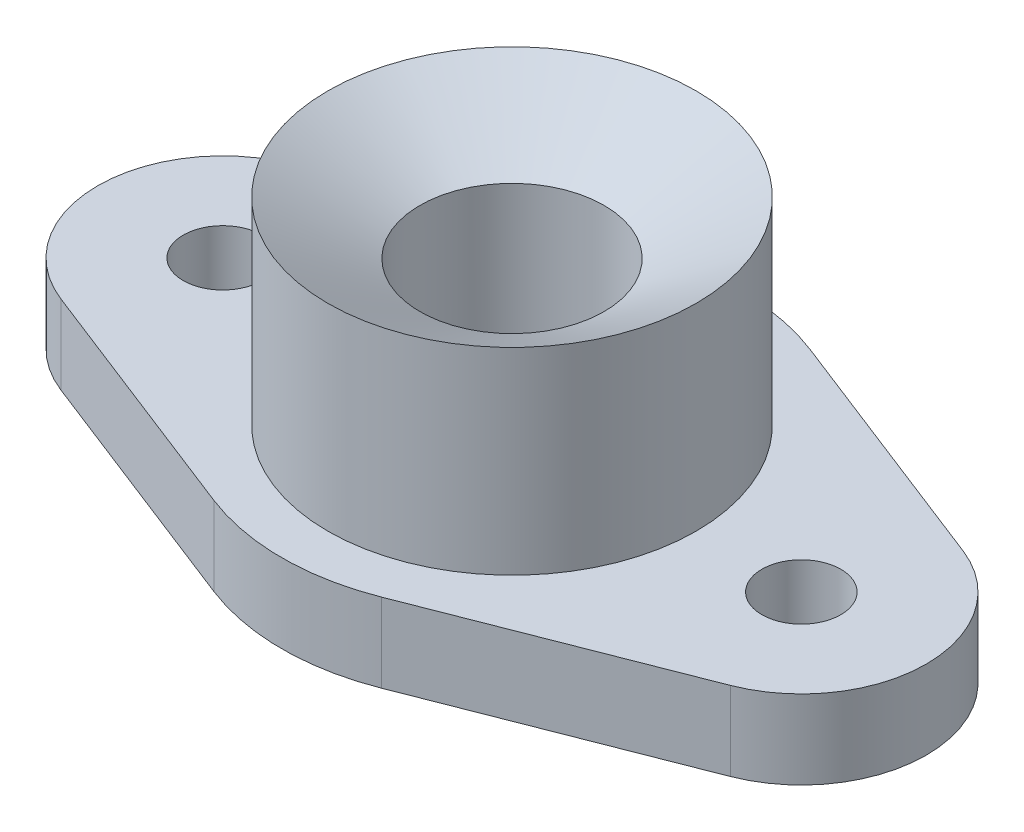
ISO-10303-21;
HEADER;
FILE_DESCRIPTION(('STEP AP214'),'2;1');
FILE_NAME('part.step','',(''),(''),'','','');
FILE_SCHEMA(('AUTOMOTIVE_DESIGN { 1 0 10303 214 1 1 1 1 }'));
ENDSEC;
DATA;
#1=APPLICATION_CONTEXT('core data for automotive mechanical design processes');
#2=APPLICATION_PROTOCOL_DEFINITION('international standard','automotive_design',2000,#1);
#3=PRODUCT_CONTEXT('',#1,'mechanical');
#4=PRODUCT('Part','Part','',(#3));
#5=PRODUCT_RELATED_PRODUCT_CATEGORY('part','',(#4));
#6=PRODUCT_DEFINITION_FORMATION('','',#4);
#7=PRODUCT_DEFINITION_CONTEXT('part definition',#1,'design');
#8=PRODUCT_DEFINITION('design','',#6,#7);
#9=PRODUCT_DEFINITION_SHAPE('','',#8);
#10=(LENGTH_UNIT() NAMED_UNIT(*) SI_UNIT(.MILLI.,.METRE.));
#11=(NAMED_UNIT(*) PLANE_ANGLE_UNIT() SI_UNIT($,.RADIAN.));
#12=(NAMED_UNIT(*) SI_UNIT($,.STERADIAN.) SOLID_ANGLE_UNIT());
#13=UNCERTAINTY_MEASURE_WITH_UNIT(LENGTH_MEASURE(1.E-05),#10,'distance_accuracy_value','');
#14=(GEOMETRIC_REPRESENTATION_CONTEXT(3) GLOBAL_UNCERTAINTY_ASSIGNED_CONTEXT((#13)) GLOBAL_UNIT_ASSIGNED_CONTEXT((#10,
#11,#12)) REPRESENTATION_CONTEXT('',''));
#15=CARTESIAN_POINT('',(0.,0.,0.));
#16=DIRECTION('',(0.,0.,1.));
#17=DIRECTION('',(1.,0.,0.));
#18=AXIS2_PLACEMENT_3D('',#15,#16,#17);
#19=CARTESIAN_POINT('',(-44.,12.,0.));
#20=DIRECTION('',(0.,1.,0.));
#21=DIRECTION('',(0.,0.,1.));
#22=AXIS2_PLACEMENT_3D('',#19,#20,#21);
#23=PLANE('',#22);
#24=CARTESIAN_POINT('',(44.,12.,0.));
#25=DIRECTION('',(0.,1.,0.));
#26=DIRECTION('',(0.,0.,1.));
#27=AXIS2_PLACEMENT_3D('',#24,#25,#26);
#28=CIRCLE('',#27,6.);
#29=CARTESIAN_POINT('',(44.,12.,6.));
#30=VERTEX_POINT('',#29);
#31=EDGE_CURVE('E221',#30,#30,#28,.T.);
#32=ORIENTED_EDGE('',*,*,#31,.F.);
#33=EDGE_LOOP('',(#32));
#34=FACE_BOUND('',#33,.T.);
#35=CARTESIAN_POINT('',(-44.,12.,0.));
#36=DIRECTION('',(0.,1.,0.));
#37=DIRECTION('',(0.,0.,1.));
#38=AXIS2_PLACEMENT_3D('',#35,#36,#37);
#39=CIRCLE('',#38,19.);
#40=CARTESIAN_POINT('',(-50.9090909090909,12.,-17.6992785957484));
#41=VERTEX_POINT('',#40);
#42=CARTESIAN_POINT('',(-50.9090909090909,12.,17.6992785957484));
#43=VERTEX_POINT('',#42);
#44=EDGE_CURVE('E172',#41,#43,#39,.T.);
#45=ORIENTED_EDGE('',*,*,#44,.T.);
#46=DIRECTION('',(0.9315409787236,0.,0.363636363636364));
#47=VECTOR('',#46,1.);
#48=CARTESIAN_POINT('',(-50.9090909090909,12.,17.6992785957484));
#49=LINE('',#48,#47);
#50=CARTESIAN_POINT('',(-12.7272727272727,12.,32.603934255326));
#51=VERTEX_POINT('',#50);
#52=EDGE_CURVE('E108',#43,#51,#49,.T.);
#53=ORIENTED_EDGE('',*,*,#52,.T.);
#54=CARTESIAN_POINT('',(0.,12.,0.));
#55=DIRECTION('',(0.,1.,0.));
#56=DIRECTION('',(0.,0.,1.));
#57=AXIS2_PLACEMENT_3D('',#54,#55,#56);
#58=CIRCLE('',#57,35.);
#59=CARTESIAN_POINT('',(12.7272727272727,12.,32.603934255326));
#60=VERTEX_POINT('',#59);
#61=EDGE_CURVE('E193',#51,#60,#58,.T.);
#62=ORIENTED_EDGE('',*,*,#61,.T.);
#63=DIRECTION('',(0.9315409787236,0.,-0.363636363636364));
#64=VECTOR('',#63,1.);
#65=CARTESIAN_POINT('',(50.9090909090909,12.,17.6992785957484));
#66=LINE('',#65,#64);
#67=CARTESIAN_POINT('',(50.9090909090909,12.,17.6992785957484));
#68=VERTEX_POINT('',#67);
#69=EDGE_CURVE('E207',#60,#68,#66,.T.);
#70=ORIENTED_EDGE('',*,*,#69,.T.);
#71=CARTESIAN_POINT('',(44.,12.,0.));
#72=DIRECTION('',(0.,1.,0.));
#73=DIRECTION('',(0.,0.,1.));
#74=AXIS2_PLACEMENT_3D('',#71,#72,#73);
#75=CIRCLE('',#74,19.);
#76=CARTESIAN_POINT('',(50.9090909090909,12.,-17.6992785957484));
#77=VERTEX_POINT('',#76);
#78=EDGE_CURVE('E127',#68,#77,#75,.T.);
#79=ORIENTED_EDGE('',*,*,#78,.T.);
#80=DIRECTION('',(-0.9315409787236,0.,-0.363636363636364));
#81=VECTOR('',#80,1.);
#82=CARTESIAN_POINT('',(50.9090909090909,12.,-17.6992785957484));
#83=LINE('',#82,#81);
#84=CARTESIAN_POINT('',(12.7272727272727,12.,-32.603934255326));
#85=VERTEX_POINT('',#84);
#86=EDGE_CURVE('E121',#77,#85,#83,.T.);
#87=ORIENTED_EDGE('',*,*,#86,.T.);
#88=CARTESIAN_POINT('',(0.,12.,0.));
#89=DIRECTION('',(0.,1.,0.));
#90=DIRECTION('',(0.,0.,1.));
#91=AXIS2_PLACEMENT_3D('',#88,#89,#90);
#92=CIRCLE('',#91,35.);
#93=CARTESIAN_POINT('',(-12.7272727272727,12.,-32.603934255326));
#94=VERTEX_POINT('',#93);
#95=EDGE_CURVE('E125',#85,#94,#92,.T.);
#96=ORIENTED_EDGE('',*,*,#95,.T.);
#97=DIRECTION('',(-0.9315409787236,0.,0.363636363636364));
#98=VECTOR('',#97,1.);
#99=CARTESIAN_POINT('',(-50.9090909090909,12.,-17.6992785957484));
#100=LINE('',#99,#98);
#101=EDGE_CURVE('E65',#94,#41,#100,.T.);
#102=ORIENTED_EDGE('',*,*,#101,.T.);
#103=EDGE_LOOP('',(#45,#53,#62,#70,#79,#87,#96,#102));
#104=FACE_BOUND('',#103,.T.);
#105=CARTESIAN_POINT('',(-44.,12.,0.));
#106=DIRECTION('',(0.,1.,0.));
#107=DIRECTION('',(0.,0.,1.));
#108=AXIS2_PLACEMENT_3D('',#105,#106,#107);
#109=CIRCLE('',#108,6.);
#110=CARTESIAN_POINT('',(-44.,12.,6.));
#111=VERTEX_POINT('',#110);
#112=EDGE_CURVE('E154',#111,#111,#109,.T.);
#113=ORIENTED_EDGE('',*,*,#112,.F.);
#114=EDGE_LOOP('',(#113));
#115=FACE_BOUND('',#114,.T.);
#116=CARTESIAN_POINT('',(0.,12.,0.));
#117=DIRECTION('',(0.,-1.,0.));
#118=DIRECTION('',(0.,0.,-1.));
#119=AXIS2_PLACEMENT_3D('',#116,#117,#118);
#120=CIRCLE('',#119,28.);
#121=CARTESIAN_POINT('',(0.,12.,-28.));
#122=VERTEX_POINT('',#121);
#123=EDGE_CURVE('E229',#122,#122,#120,.T.);
#124=ORIENTED_EDGE('',*,*,#123,.T.);
#125=EDGE_LOOP('',(#124));
#126=FACE_BOUND('',#125,.T.);
#127=ADVANCED_FACE('F47',(#34,#104,#115,#126),#23,.T.);
#128=CARTESIAN_POINT('',(-44.,0.,0.));
#129=DIRECTION('',(0.,1.,0.));
#130=DIRECTION('',(0.,0.,1.));
#131=AXIS2_PLACEMENT_3D('',#128,#129,#130);
#132=PLANE('',#131);
#133=CARTESIAN_POINT('',(0.,0.,0.));
#134=DIRECTION('',(0.,1.,0.));
#135=DIRECTION('',(0.,0.,1.));
#136=AXIS2_PLACEMENT_3D('',#133,#134,#135);
#137=CIRCLE('',#136,14.);
#138=CARTESIAN_POINT('',(0.,0.,14.));
#139=VERTEX_POINT('',#138);
#140=EDGE_CURVE('E244',#139,#139,#137,.F.);
#141=ORIENTED_EDGE('',*,*,#140,.F.);
#142=EDGE_LOOP('',(#141));
#143=FACE_BOUND('',#142,.T.);
#144=CARTESIAN_POINT('',(-44.,0.,0.));
#145=DIRECTION('',(0.,1.,0.));
#146=DIRECTION('',(0.,0.,1.));
#147=AXIS2_PLACEMENT_3D('',#144,#145,#146);
#148=CIRCLE('',#147,19.);
#149=CARTESIAN_POINT('',(-50.9090909090909,0.,-17.6992785957484));
#150=VERTEX_POINT('',#149);
#151=CARTESIAN_POINT('',(-50.9090909090909,0.,17.6992785957484));
#152=VERTEX_POINT('',#151);
#153=EDGE_CURVE('E149',#150,#152,#148,.T.);
#154=ORIENTED_EDGE('',*,*,#153,.F.);
#155=DIRECTION('',(-0.9315409787236,0.,0.363636363636364));
#156=VECTOR('',#155,1.);
#157=CARTESIAN_POINT('',(-50.9090909090909,0.,-17.6992785957484));
#158=LINE('',#157,#156);
#159=CARTESIAN_POINT('',(-12.7272727272727,0.,-32.603934255326));
#160=VERTEX_POINT('',#159);
#161=EDGE_CURVE('E100',#160,#150,#158,.T.);
#162=ORIENTED_EDGE('',*,*,#161,.F.);
#163=CARTESIAN_POINT('',(0.,0.,0.));
#164=DIRECTION('',(0.,1.,0.));
#165=DIRECTION('',(0.,0.,1.));
#166=AXIS2_PLACEMENT_3D('',#163,#164,#165);
#167=CIRCLE('',#166,35.);
#168=CARTESIAN_POINT('',(12.7272727272727,0.,-32.603934255326));
#169=VERTEX_POINT('',#168);
#170=EDGE_CURVE('E94',#169,#160,#167,.T.);
#171=ORIENTED_EDGE('',*,*,#170,.F.);
#172=DIRECTION('',(-0.9315409787236,0.,-0.363636363636364));
#173=VECTOR('',#172,1.);
#174=CARTESIAN_POINT('',(50.9090909090909,0.,-17.6992785957484));
#175=LINE('',#174,#173);
#176=CARTESIAN_POINT('',(50.9090909090909,0.,-17.6992785957484));
#177=VERTEX_POINT('',#176);
#178=EDGE_CURVE('E136',#177,#169,#175,.T.);
#179=ORIENTED_EDGE('',*,*,#178,.F.);
#180=CARTESIAN_POINT('',(44.,0.,0.));
#181=DIRECTION('',(0.,1.,0.));
#182=DIRECTION('',(0.,0.,1.));
#183=AXIS2_PLACEMENT_3D('',#180,#181,#182);
#184=CIRCLE('',#183,19.);
#185=CARTESIAN_POINT('',(50.9090909090909,0.,17.6992785957484));
#186=VERTEX_POINT('',#185);
#187=EDGE_CURVE('E163',#186,#177,#184,.T.);
#188=ORIENTED_EDGE('',*,*,#187,.F.);
#189=DIRECTION('',(0.9315409787236,0.,-0.363636363636364));
#190=VECTOR('',#189,1.);
#191=CARTESIAN_POINT('',(50.9090909090909,0.,17.6992785957484));
#192=LINE('',#191,#190);
#193=CARTESIAN_POINT('',(12.7272727272727,0.,32.603934255326));
#194=VERTEX_POINT('',#193);
#195=EDGE_CURVE('E160',#194,#186,#192,.T.);
#196=ORIENTED_EDGE('',*,*,#195,.F.);
#197=CARTESIAN_POINT('',(0.,0.,0.));
#198=DIRECTION('',(0.,1.,0.));
#199=DIRECTION('',(0.,0.,1.));
#200=AXIS2_PLACEMENT_3D('',#197,#198,#199);
#201=CIRCLE('',#200,35.);
#202=CARTESIAN_POINT('',(-12.7272727272727,0.,32.603934255326));
#203=VERTEX_POINT('',#202);
#204=EDGE_CURVE('E157',#203,#194,#201,.T.);
#205=ORIENTED_EDGE('',*,*,#204,.F.);
#206=DIRECTION('',(0.9315409787236,0.,0.363636363636364));
#207=VECTOR('',#206,1.);
#208=CARTESIAN_POINT('',(-50.9090909090909,0.,17.6992785957484));
#209=LINE('',#208,#207);
#210=EDGE_CURVE('E153',#152,#203,#209,.T.);
#211=ORIENTED_EDGE('',*,*,#210,.F.);
#212=EDGE_LOOP('',(#154,#162,#171,#179,#188,#196,#205,#211));
#213=FACE_BOUND('',#212,.T.);
#214=CARTESIAN_POINT('',(-44.,0.,0.));
#215=DIRECTION('',(0.,1.,0.));
#216=DIRECTION('',(0.,0.,1.));
#217=AXIS2_PLACEMENT_3D('',#214,#215,#216);
#218=CIRCLE('',#217,6.);
#219=CARTESIAN_POINT('',(-44.,0.,6.));
#220=VERTEX_POINT('',#219);
#221=EDGE_CURVE('E217',#220,#220,#218,.T.);
#222=ORIENTED_EDGE('',*,*,#221,.T.);
#223=EDGE_LOOP('',(#222));
#224=FACE_BOUND('',#223,.T.);
#225=CARTESIAN_POINT('',(44.,0.,0.));
#226=DIRECTION('',(0.,1.,0.));
#227=DIRECTION('',(0.,0.,1.));
#228=AXIS2_PLACEMENT_3D('',#225,#226,#227);
#229=CIRCLE('',#228,6.);
#230=CARTESIAN_POINT('',(44.,0.,6.));
#231=VERTEX_POINT('',#230);
#232=EDGE_CURVE('E225',#231,#231,#229,.T.);
#233=ORIENTED_EDGE('',*,*,#232,.T.);
#234=EDGE_LOOP('',(#233));
#235=FACE_BOUND('',#234,.T.);
#236=ADVANCED_FACE('F197',(#143,#213,#224,#235),#132,.F.);
#237=CARTESIAN_POINT('',(-44.,12.,0.));
#238=DIRECTION('',(0.,-1.,0.));
#239=DIRECTION('',(0.,0.,-1.));
#240=AXIS2_PLACEMENT_3D('',#237,#238,#239);
#241=CYLINDRICAL_SURFACE('',#240,19.);
#242=ORIENTED_EDGE('',*,*,#153,.T.);
#243=DIRECTION('',(0.,-1.,0.));
#244=VECTOR('',#243,1.);
#245=CARTESIAN_POINT('',(-50.9090909090909,12.,17.6992785957484));
#246=LINE('',#245,#244);
#247=EDGE_CURVE('E11',#43,#152,#246,.T.);
#248=ORIENTED_EDGE('',*,*,#247,.F.);
#249=ORIENTED_EDGE('',*,*,#44,.F.);
#250=DIRECTION('',(0.,-1.,0.));
#251=VECTOR('',#250,1.);
#252=CARTESIAN_POINT('',(-50.9090909090909,12.,-17.6992785957484));
#253=LINE('',#252,#251);
#254=EDGE_CURVE('E145',#41,#150,#253,.T.);
#255=ORIENTED_EDGE('',*,*,#254,.T.);
#256=EDGE_LOOP('',(#242,#248,#249,#255));
#257=FACE_BOUND('',#256,.T.);
#258=ADVANCED_FACE('F49',(#257),#241,.T.);
#259=CARTESIAN_POINT('',(-50.9090909090909,12.,17.6992785957484));
#260=DIRECTION('',(0.363636363636364,0.,-0.9315409787236));
#261=DIRECTION('',(-0.9315409787236,0.,-0.363636363636364));
#262=AXIS2_PLACEMENT_3D('',#259,#260,#261);
#263=PLANE('',#262);
#264=ORIENTED_EDGE('',*,*,#210,.T.);
#265=DIRECTION('',(0.,-1.,0.));
#266=VECTOR('',#265,1.);
#267=CARTESIAN_POINT('',(-12.7272727272727,12.,32.603934255326));
#268=LINE('',#267,#266);
#269=EDGE_CURVE('E57',#51,#203,#268,.T.);
#270=ORIENTED_EDGE('',*,*,#269,.F.);
#271=ORIENTED_EDGE('',*,*,#52,.F.);
#272=ORIENTED_EDGE('',*,*,#247,.T.);
#273=EDGE_LOOP('',(#264,#270,#271,#272));
#274=FACE_BOUND('',#273,.T.);
#275=ADVANCED_FACE('F258',(#274),#263,.F.);
#276=CARTESIAN_POINT('',(0.,12.,0.));
#277=DIRECTION('',(0.,-1.,0.));
#278=DIRECTION('',(0.,0.,-1.));
#279=AXIS2_PLACEMENT_3D('',#276,#277,#278);
#280=CYLINDRICAL_SURFACE('',#279,35.);
#281=ORIENTED_EDGE('',*,*,#204,.T.);
#282=DIRECTION('',(0.,-1.,0.));
#283=VECTOR('',#282,1.);
#284=CARTESIAN_POINT('',(12.7272727272727,12.,32.603934255326));
#285=LINE('',#284,#283);
#286=EDGE_CURVE('E183',#60,#194,#285,.T.);
#287=ORIENTED_EDGE('',*,*,#286,.F.);
#288=ORIENTED_EDGE('',*,*,#61,.F.);
#289=ORIENTED_EDGE('',*,*,#269,.T.);
#290=EDGE_LOOP('',(#281,#287,#288,#289));
#291=FACE_BOUND('',#290,.T.);
#292=ADVANCED_FACE('F191',(#291),#280,.T.);
#293=CARTESIAN_POINT('',(50.9090909090909,12.,17.6992785957484));
#294=DIRECTION('',(-0.363636363636364,0.,-0.9315409787236));
#295=DIRECTION('',(-0.9315409787236,0.,0.363636363636364));
#296=AXIS2_PLACEMENT_3D('',#293,#294,#295);
#297=PLANE('',#296);
#298=ORIENTED_EDGE('',*,*,#195,.T.);
#299=DIRECTION('',(0.,-1.,0.));
#300=VECTOR('',#299,1.);
#301=CARTESIAN_POINT('',(50.9090909090909,12.,17.6992785957484));
#302=LINE('',#301,#300);
#303=EDGE_CURVE('E179',#68,#186,#302,.T.);
#304=ORIENTED_EDGE('',*,*,#303,.F.);
#305=ORIENTED_EDGE('',*,*,#69,.F.);
#306=ORIENTED_EDGE('',*,*,#286,.T.);
#307=EDGE_LOOP('',(#298,#304,#305,#306));
#308=FACE_BOUND('',#307,.T.);
#309=ADVANCED_FACE('F202',(#308),#297,.F.);
#310=CARTESIAN_POINT('',(44.,12.,0.));
#311=DIRECTION('',(0.,-1.,0.));
#312=DIRECTION('',(0.,0.,-1.));
#313=AXIS2_PLACEMENT_3D('',#310,#311,#312);
#314=CYLINDRICAL_SURFACE('',#313,19.);
#315=ORIENTED_EDGE('',*,*,#187,.T.);
#316=DIRECTION('',(0.,-1.,0.));
#317=VECTOR('',#316,1.);
#318=CARTESIAN_POINT('',(50.9090909090909,12.,-17.6992785957484));
#319=LINE('',#318,#317);
#320=EDGE_CURVE('E138',#77,#177,#319,.T.);
#321=ORIENTED_EDGE('',*,*,#320,.F.);
#322=ORIENTED_EDGE('',*,*,#78,.F.);
#323=ORIENTED_EDGE('',*,*,#303,.T.);
#324=EDGE_LOOP('',(#315,#321,#322,#323));
#325=FACE_BOUND('',#324,.T.);
#326=ADVANCED_FACE('F205',(#325),#314,.T.);
#327=CARTESIAN_POINT('',(50.9090909090909,12.,-17.6992785957484));
#328=DIRECTION('',(-0.363636363636364,0.,0.9315409787236));
#329=DIRECTION('',(0.9315409787236,0.,0.363636363636364));
#330=AXIS2_PLACEMENT_3D('',#327,#328,#329);
#331=PLANE('',#330);
#332=ORIENTED_EDGE('',*,*,#178,.T.);
#333=DIRECTION('',(0.,-1.,0.));
#334=VECTOR('',#333,1.);
#335=CARTESIAN_POINT('',(12.7272727272727,12.,-32.603934255326));
#336=LINE('',#335,#334);
#337=EDGE_CURVE('E133',#85,#169,#336,.T.);
#338=ORIENTED_EDGE('',*,*,#337,.F.);
#339=ORIENTED_EDGE('',*,*,#86,.F.);
#340=ORIENTED_EDGE('',*,*,#320,.T.);
#341=EDGE_LOOP('',(#332,#338,#339,#340));
#342=FACE_BOUND('',#341,.T.);
#343=ADVANCED_FACE('F134',(#342),#331,.F.);
#344=CARTESIAN_POINT('',(0.,12.,0.));
#345=DIRECTION('',(0.,-1.,0.));
#346=DIRECTION('',(0.,0.,-1.));
#347=AXIS2_PLACEMENT_3D('',#344,#345,#346);
#348=CYLINDRICAL_SURFACE('',#347,35.);
#349=ORIENTED_EDGE('',*,*,#170,.T.);
#350=DIRECTION('',(0.,-1.,0.));
#351=VECTOR('',#350,1.);
#352=CARTESIAN_POINT('',(-12.7272727272727,12.,-32.603934255326));
#353=LINE('',#352,#351);
#354=EDGE_CURVE('E139',#94,#160,#353,.T.);
#355=ORIENTED_EDGE('',*,*,#354,.F.);
#356=ORIENTED_EDGE('',*,*,#95,.F.);
#357=ORIENTED_EDGE('',*,*,#337,.T.);
#358=EDGE_LOOP('',(#349,#355,#356,#357));
#359=FACE_BOUND('',#358,.T.);
#360=ADVANCED_FACE('F141',(#359),#348,.T.);
#361=CARTESIAN_POINT('',(-50.9090909090909,12.,-17.6992785957484));
#362=DIRECTION('',(0.363636363636364,0.,0.9315409787236));
#363=DIRECTION('',(0.9315409787236,0.,-0.363636363636364));
#364=AXIS2_PLACEMENT_3D('',#361,#362,#363);
#365=PLANE('',#364);
#366=ORIENTED_EDGE('',*,*,#161,.T.);
#367=ORIENTED_EDGE('',*,*,#254,.F.);
#368=ORIENTED_EDGE('',*,*,#101,.F.);
#369=ORIENTED_EDGE('',*,*,#354,.T.);
#370=EDGE_LOOP('',(#366,#367,#368,#369));
#371=FACE_BOUND('',#370,.T.);
#372=ADVANCED_FACE('F265',(#371),#365,.F.);
#373=CARTESIAN_POINT('',(-44.,12.,0.));
#374=DIRECTION('',(0.,-1.,0.));
#375=DIRECTION('',(0.,0.,-1.));
#376=AXIS2_PLACEMENT_3D('',#373,#374,#375);
#377=CYLINDRICAL_SURFACE('',#376,6.);
#378=ORIENTED_EDGE('',*,*,#112,.T.);
#379=EDGE_LOOP('',(#378));
#380=FACE_BOUND('',#379,.T.);
#381=ORIENTED_EDGE('',*,*,#221,.F.);
#382=EDGE_LOOP('',(#381));
#383=FACE_BOUND('',#382,.T.);
#384=ADVANCED_FACE('F268',(#380,#383),#377,.F.);
#385=CARTESIAN_POINT('',(44.,12.,0.));
#386=DIRECTION('',(0.,-1.,0.));
#387=DIRECTION('',(0.,0.,-1.));
#388=AXIS2_PLACEMENT_3D('',#385,#386,#387);
#389=CYLINDRICAL_SURFACE('',#388,6.);
#390=ORIENTED_EDGE('',*,*,#31,.T.);
#391=EDGE_LOOP('',(#390));
#392=FACE_BOUND('',#391,.T.);
#393=ORIENTED_EDGE('',*,*,#232,.F.);
#394=EDGE_LOOP('',(#393));
#395=FACE_BOUND('',#394,.T.);
#396=ADVANCED_FACE('F322',(#392,#395),#389,.F.);
#397=CARTESIAN_POINT('',(0.,0.,0.));
#398=DIRECTION('',(0.,-1.,0.));
#399=DIRECTION('',(0.,0.,-1.));
#400=AXIS2_PLACEMENT_3D('',#397,#398,#399);
#401=CYLINDRICAL_SURFACE('',#400,28.);
#402=ORIENTED_EDGE('',*,*,#123,.F.);
#403=EDGE_LOOP('',(#402));
#404=FACE_BOUND('',#403,.T.);
#405=CARTESIAN_POINT('',(0.,42.,0.));
#406=DIRECTION('',(0.,-1.,0.));
#407=DIRECTION('',(0.,0.,-1.));
#408=AXIS2_PLACEMENT_3D('',#405,#406,#407);
#409=CIRCLE('',#408,28.);
#410=CARTESIAN_POINT('',(0.,42.,-28.));
#411=VERTEX_POINT('',#410);
#412=EDGE_CURVE('E236',#411,#411,#409,.T.);
#413=ORIENTED_EDGE('',*,*,#412,.T.);
#414=EDGE_LOOP('',(#413));
#415=FACE_BOUND('',#414,.T.);
#416=ADVANCED_FACE('F329',(#404,#415),#401,.T.);
#417=CARTESIAN_POINT('',(0.,33.9170962313452,0.));
#418=DIRECTION('',(0.,1.,0.));
#419=DIRECTION('',(0.,0.,1.));
#420=AXIS2_PLACEMENT_3D('',#417,#418,#419);
#421=CONICAL_SURFACE('',#420,14.,1.04719755119659);
#422=ORIENTED_EDGE('',*,*,#412,.F.);
#423=EDGE_LOOP('',(#422));
#424=FACE_BOUND('',#423,.T.);
#425=CARTESIAN_POINT('',(0.,33.9170962313452,0.));
#426=DIRECTION('',(0.,-1.,0.));
#427=DIRECTION('',(0.,0.,-1.));
#428=AXIS2_PLACEMENT_3D('',#425,#426,#427);
#429=CIRCLE('',#428,14.);
#430=CARTESIAN_POINT('',(0.,33.9170962313452,-14.));
#431=VERTEX_POINT('',#430);
#432=EDGE_CURVE('E240',#431,#431,#429,.T.);
#433=ORIENTED_EDGE('',*,*,#432,.T.);
#434=EDGE_LOOP('',(#433));
#435=FACE_BOUND('',#434,.T.);
#436=ADVANCED_FACE('F343',(#424,#435),#421,.F.);
#437=CARTESIAN_POINT('',(0.,0.,0.));
#438=DIRECTION('',(0.,-1.,0.));
#439=DIRECTION('',(0.,0.,-1.));
#440=AXIS2_PLACEMENT_3D('',#437,#438,#439);
#441=CYLINDRICAL_SURFACE('',#440,14.);
#442=ORIENTED_EDGE('',*,*,#432,.F.);
#443=EDGE_LOOP('',(#442));
#444=FACE_BOUND('',#443,.T.);
#445=ORIENTED_EDGE('',*,*,#140,.T.);
#446=EDGE_LOOP('',(#445));
#447=FACE_BOUND('',#446,.T.);
#448=ADVANCED_FACE('F249',(#444,#447),#441,.F.);
#449=CLOSED_SHELL('',(#127,#236,#258,#275,#292,#309,#326,#343,#360,#372,#384,#396,#416,#436,#448));
#450=MANIFOLD_SOLID_BREP('B2',#449);
#451=ADVANCED_BREP_SHAPE_REPRESENTATION('',(#18,#450),#14);
#452=SHAPE_DEFINITION_REPRESENTATION(#9,#451);
ENDSEC;
END-ISO-10303-21;
